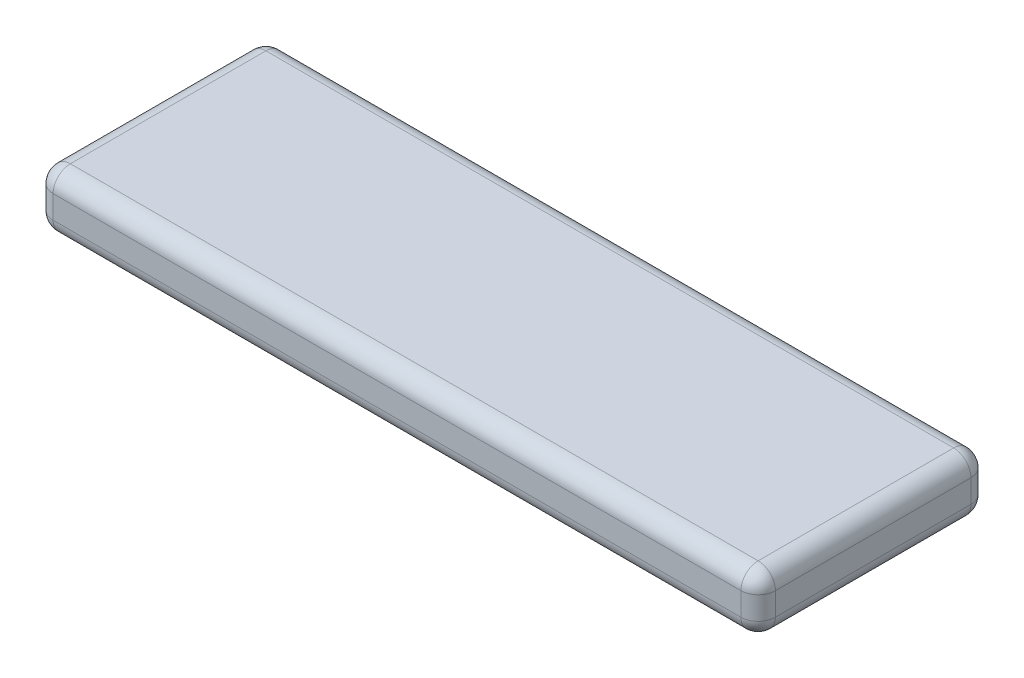
ISO-10303-21;
HEADER;
FILE_DESCRIPTION(('STEP AP214'),'2;1');
FILE_NAME('part.step','',(''),(''),'','','');
FILE_SCHEMA(('AUTOMOTIVE_DESIGN { 1 0 10303 214 1 1 1 1 }'));
ENDSEC;
DATA;
#1=APPLICATION_CONTEXT('core data for automotive mechanical design processes');
#2=APPLICATION_PROTOCOL_DEFINITION('international standard','automotive_design',2000,#1);
#3=PRODUCT_CONTEXT('',#1,'mechanical');
#4=PRODUCT('Part','Part','',(#3));
#5=PRODUCT_RELATED_PRODUCT_CATEGORY('part','',(#4));
#6=PRODUCT_DEFINITION_FORMATION('','',#4);
#7=PRODUCT_DEFINITION_CONTEXT('part definition',#1,'design');
#8=PRODUCT_DEFINITION('design','',#6,#7);
#9=PRODUCT_DEFINITION_SHAPE('','',#8);
#10=(LENGTH_UNIT() NAMED_UNIT(*) SI_UNIT(.MILLI.,.METRE.));
#11=(NAMED_UNIT(*) PLANE_ANGLE_UNIT() SI_UNIT($,.RADIAN.));
#12=(NAMED_UNIT(*) SI_UNIT($,.STERADIAN.) SOLID_ANGLE_UNIT());
#13=UNCERTAINTY_MEASURE_WITH_UNIT(LENGTH_MEASURE(1.E-05),#10,'distance_accuracy_value','');
#14=(GEOMETRIC_REPRESENTATION_CONTEXT(3) GLOBAL_UNCERTAINTY_ASSIGNED_CONTEXT((#13)) GLOBAL_UNIT_ASSIGNED_CONTEXT((#10,
#11,#12)) REPRESENTATION_CONTEXT('',''));
#15=CARTESIAN_POINT('',(0.,0.,0.));
#16=DIRECTION('',(0.,0.,1.));
#17=DIRECTION('',(1.,0.,0.));
#18=AXIS2_PLACEMENT_3D('',#15,#16,#17);
#19=CARTESIAN_POINT('',(0.,100.,0.));
#20=DIRECTION('',(1.,0.,0.));
#21=DIRECTION('',(0.,0.,-1.));
#22=AXIS2_PLACEMENT_3D('',#19,#20,#21);
#23=PLANE('',#22);
#24=DIRECTION('',(0.,-1.,0.));
#25=VECTOR('',#24,1.);
#26=CARTESIAN_POINT('',(0.,100.,-370.));
#27=LINE('',#26,#25);
#28=CARTESIAN_POINT('',(0.,70.,-370.));
#29=VERTEX_POINT('',#28);
#30=CARTESIAN_POINT('',(0.,30.,-370.));
#31=VERTEX_POINT('',#30);
#32=EDGE_CURVE('E130',#29,#31,#27,.T.);
#33=ORIENTED_EDGE('',*,*,#32,.T.);
#34=DIRECTION('',(0.,0.,1.));
#35=VECTOR('',#34,1.);
#36=CARTESIAN_POINT('',(0.,30.,0.));
#37=LINE('',#36,#35);
#38=CARTESIAN_POINT('',(0.,30.,-30.));
#39=VERTEX_POINT('',#38);
#40=EDGE_CURVE('E126',#31,#39,#37,.T.);
#41=ORIENTED_EDGE('',*,*,#40,.T.);
#42=DIRECTION('',(0.,-1.,0.));
#43=VECTOR('',#42,1.);
#44=CARTESIAN_POINT('',(0.,100.,-30.));
#45=LINE('',#44,#43);
#46=CARTESIAN_POINT('',(0.,70.,-30.));
#47=VERTEX_POINT('',#46);
#48=EDGE_CURVE('E121',#39,#47,#45,.F.);
#49=ORIENTED_EDGE('',*,*,#48,.T.);
#50=DIRECTION('',(0.,0.,1.));
#51=VECTOR('',#50,1.);
#52=CARTESIAN_POINT('',(0.,70.,0.));
#53=LINE('',#52,#51);
#54=EDGE_CURVE('E123',#47,#29,#53,.F.);
#55=ORIENTED_EDGE('',*,*,#54,.T.);
#56=EDGE_LOOP('',(#33,#41,#49,#55));
#57=FACE_BOUND('',#56,.T.);
#58=ADVANCED_FACE('F33',(#57),#23,.F.);
#59=CARTESIAN_POINT('',(0.,100.,0.));
#60=DIRECTION('',(0.,0.,-1.));
#61=DIRECTION('',(-1.,0.,0.));
#62=AXIS2_PLACEMENT_3D('',#59,#60,#61);
#63=PLANE('',#62);
#64=DIRECTION('',(0.,-1.,0.));
#65=VECTOR('',#64,1.);
#66=CARTESIAN_POINT('',(1226.,100.,0.));
#67=LINE('',#66,#65);
#68=CARTESIAN_POINT('',(1226.,30.,0.));
#69=VERTEX_POINT('',#68);
#70=CARTESIAN_POINT('',(1226.,70.,0.));
#71=VERTEX_POINT('',#70);
#72=EDGE_CURVE('E229',#69,#71,#67,.F.);
#73=ORIENTED_EDGE('',*,*,#72,.T.);
#74=DIRECTION('',(1.,0.,0.));
#75=VECTOR('',#74,1.);
#76=CARTESIAN_POINT('',(0.,70.,0.));
#77=LINE('',#76,#75);
#78=CARTESIAN_POINT('',(30.,70.,0.));
#79=VERTEX_POINT('',#78);
#80=EDGE_CURVE('E232',#71,#79,#77,.F.);
#81=ORIENTED_EDGE('',*,*,#80,.T.);
#82=DIRECTION('',(0.,-1.,0.));
#83=VECTOR('',#82,1.);
#84=CARTESIAN_POINT('',(30.,100.,0.));
#85=LINE('',#84,#83);
#86=CARTESIAN_POINT('',(30.,30.,0.));
#87=VERTEX_POINT('',#86);
#88=EDGE_CURVE('E152',#79,#87,#85,.T.);
#89=ORIENTED_EDGE('',*,*,#88,.T.);
#90=DIRECTION('',(1.,0.,0.));
#91=VECTOR('',#90,1.);
#92=CARTESIAN_POINT('',(1256.,30.,0.));
#93=LINE('',#92,#91);
#94=EDGE_CURVE('E227',#87,#69,#93,.T.);
#95=ORIENTED_EDGE('',*,*,#94,.T.);
#96=EDGE_LOOP('',(#73,#81,#89,#95));
#97=FACE_BOUND('',#96,.T.);
#98=ADVANCED_FACE('F313',(#97),#63,.F.);
#99=CARTESIAN_POINT('',(1256.,100.,0.));
#100=DIRECTION('',(-1.,0.,0.));
#101=DIRECTION('',(0.,0.,1.));
#102=AXIS2_PLACEMENT_3D('',#99,#100,#101);
#103=PLANE('',#102);
#104=DIRECTION('',(0.,-1.,0.));
#105=VECTOR('',#104,1.);
#106=CARTESIAN_POINT('',(1256.,100.,-370.));
#107=LINE('',#106,#105);
#108=CARTESIAN_POINT('',(1256.,30.,-370.));
#109=VERTEX_POINT('',#108);
#110=CARTESIAN_POINT('',(1256.,70.,-370.));
#111=VERTEX_POINT('',#110);
#112=EDGE_CURVE('E211',#109,#111,#107,.F.);
#113=ORIENTED_EDGE('',*,*,#112,.T.);
#114=DIRECTION('',(0.,0.,-1.));
#115=VECTOR('',#114,1.);
#116=CARTESIAN_POINT('',(1256.,70.,0.));
#117=LINE('',#116,#115);
#118=CARTESIAN_POINT('',(1256.,70.,-30.));
#119=VERTEX_POINT('',#118);
#120=EDGE_CURVE('E240',#111,#119,#117,.F.);
#121=ORIENTED_EDGE('',*,*,#120,.T.);
#122=DIRECTION('',(0.,-1.,0.));
#123=VECTOR('',#122,1.);
#124=CARTESIAN_POINT('',(1256.,100.,-30.));
#125=LINE('',#124,#123);
#126=CARTESIAN_POINT('',(1256.,30.,-30.));
#127=VERTEX_POINT('',#126);
#128=EDGE_CURVE('E237',#119,#127,#125,.T.);
#129=ORIENTED_EDGE('',*,*,#128,.T.);
#130=DIRECTION('',(0.,0.,-1.));
#131=VECTOR('',#130,1.);
#132=CARTESIAN_POINT('',(1256.,30.,-400.));
#133=LINE('',#132,#131);
#134=EDGE_CURVE('E234',#127,#109,#133,.T.);
#135=ORIENTED_EDGE('',*,*,#134,.T.);
#136=EDGE_LOOP('',(#113,#121,#129,#135));
#137=FACE_BOUND('',#136,.T.);
#138=ADVANCED_FACE('F305',(#137),#103,.F.);
#139=CARTESIAN_POINT('',(0.,100.,-400.));
#140=DIRECTION('',(0.,0.,1.));
#141=DIRECTION('',(1.,0.,0.));
#142=AXIS2_PLACEMENT_3D('',#139,#140,#141);
#143=PLANE('',#142);
#144=DIRECTION('',(-1.,0.,0.));
#145=VECTOR('',#144,1.);
#146=CARTESIAN_POINT('',(0.,30.,-400.));
#147=LINE('',#146,#145);
#148=CARTESIAN_POINT('',(1226.,30.,-400.));
#149=VERTEX_POINT('',#148);
#150=CARTESIAN_POINT('',(30.,30.,-400.));
#151=VERTEX_POINT('',#150);
#152=EDGE_CURVE('E216',#149,#151,#147,.T.);
#153=ORIENTED_EDGE('',*,*,#152,.T.);
#154=DIRECTION('',(0.,-1.,0.));
#155=VECTOR('',#154,1.);
#156=CARTESIAN_POINT('',(30.,100.,-400.));
#157=LINE('',#156,#155);
#158=CARTESIAN_POINT('',(30.,70.,-400.));
#159=VERTEX_POINT('',#158);
#160=EDGE_CURVE('E219',#151,#159,#157,.F.);
#161=ORIENTED_EDGE('',*,*,#160,.T.);
#162=DIRECTION('',(-1.,0.,0.));
#163=VECTOR('',#162,1.);
#164=CARTESIAN_POINT('',(0.,70.,-400.));
#165=LINE('',#164,#163);
#166=CARTESIAN_POINT('',(1226.,70.,-400.));
#167=VERTEX_POINT('',#166);
#168=EDGE_CURVE('E217',#159,#167,#165,.F.);
#169=ORIENTED_EDGE('',*,*,#168,.T.);
#170=DIRECTION('',(0.,-1.,0.));
#171=VECTOR('',#170,1.);
#172=CARTESIAN_POINT('',(1226.,100.,-400.));
#173=LINE('',#172,#171);
#174=EDGE_CURVE('E213',#167,#149,#173,.T.);
#175=ORIENTED_EDGE('',*,*,#174,.T.);
#176=EDGE_LOOP('',(#153,#161,#169,#175));
#177=FACE_BOUND('',#176,.T.);
#178=ADVANCED_FACE('F288',(#177),#143,.F.);
#179=CARTESIAN_POINT('',(0.,100.,0.));
#180=DIRECTION('',(0.,-1.,0.));
#181=DIRECTION('',(0.,0.,-1.));
#182=AXIS2_PLACEMENT_3D('',#179,#180,#181);
#183=PLANE('',#182);
#184=DIRECTION('',(0.,0.,-1.));
#185=VECTOR('',#184,1.);
#186=CARTESIAN_POINT('',(1226.,100.,0.));
#187=LINE('',#186,#185);
#188=CARTESIAN_POINT('',(1226.,100.,-30.));
#189=VERTEX_POINT('',#188);
#190=CARTESIAN_POINT('',(1226.,100.,-370.));
#191=VERTEX_POINT('',#190);
#192=EDGE_CURVE('E42',#189,#191,#187,.T.);
#193=ORIENTED_EDGE('',*,*,#192,.T.);
#194=DIRECTION('',(-1.,0.,0.));
#195=VECTOR('',#194,1.);
#196=CARTESIAN_POINT('',(0.,100.,-370.));
#197=LINE('',#196,#195);
#198=CARTESIAN_POINT('',(30.,100.,-370.));
#199=VERTEX_POINT('',#198);
#200=EDGE_CURVE('E11',#191,#199,#197,.T.);
#201=ORIENTED_EDGE('',*,*,#200,.T.);
#202=DIRECTION('',(0.,0.,1.));
#203=VECTOR('',#202,1.);
#204=CARTESIAN_POINT('',(30.,100.,0.));
#205=LINE('',#204,#203);
#206=CARTESIAN_POINT('',(30.,100.,-30.));
#207=VERTEX_POINT('',#206);
#208=EDGE_CURVE('E242',#199,#207,#205,.T.);
#209=ORIENTED_EDGE('',*,*,#208,.T.);
#210=DIRECTION('',(1.,0.,0.));
#211=VECTOR('',#210,1.);
#212=CARTESIAN_POINT('',(0.,100.,-30.));
#213=LINE('',#212,#211);
#214=EDGE_CURVE('E53',#207,#189,#213,.T.);
#215=ORIENTED_EDGE('',*,*,#214,.T.);
#216=EDGE_LOOP('',(#193,#201,#209,#215));
#217=FACE_BOUND('',#216,.T.);
#218=ADVANCED_FACE('F293',(#217),#183,.F.);
#219=CARTESIAN_POINT('',(0.,0.,0.));
#220=DIRECTION('',(0.,-1.,0.));
#221=DIRECTION('',(0.,0.,-1.));
#222=AXIS2_PLACEMENT_3D('',#219,#220,#221);
#223=PLANE('',#222);
#224=DIRECTION('',(1.,0.,0.));
#225=VECTOR('',#224,1.);
#226=CARTESIAN_POINT('',(0.,0.,-30.));
#227=LINE('',#226,#225);
#228=CARTESIAN_POINT('',(1226.,0.,-30.));
#229=VERTEX_POINT('',#228);
#230=CARTESIAN_POINT('',(30.,0.,-30.));
#231=VERTEX_POINT('',#230);
#232=EDGE_CURVE('E276',#229,#231,#227,.F.);
#233=ORIENTED_EDGE('',*,*,#232,.T.);
#234=DIRECTION('',(0.,0.,1.));
#235=VECTOR('',#234,1.);
#236=CARTESIAN_POINT('',(30.,0.,-400.));
#237=LINE('',#236,#235);
#238=CARTESIAN_POINT('',(30.,0.,-370.));
#239=VERTEX_POINT('',#238);
#240=EDGE_CURVE('E221',#231,#239,#237,.F.);
#241=ORIENTED_EDGE('',*,*,#240,.T.);
#242=DIRECTION('',(-1.,0.,0.));
#243=VECTOR('',#242,1.);
#244=CARTESIAN_POINT('',(1256.,0.,-370.));
#245=LINE('',#244,#243);
#246=CARTESIAN_POINT('',(1226.,0.,-370.));
#247=VERTEX_POINT('',#246);
#248=EDGE_CURVE('E266',#239,#247,#245,.F.);
#249=ORIENTED_EDGE('',*,*,#248,.T.);
#250=DIRECTION('',(0.,0.,-1.));
#251=VECTOR('',#250,1.);
#252=CARTESIAN_POINT('',(1226.,0.,0.));
#253=LINE('',#252,#251);
#254=EDGE_CURVE('E271',#247,#229,#253,.F.);
#255=ORIENTED_EDGE('',*,*,#254,.T.);
#256=EDGE_LOOP('',(#233,#241,#249,#255));
#257=FACE_BOUND('',#256,.T.);
#258=ADVANCED_FACE('F274',(#257),#223,.T.);
#259=CARTESIAN_POINT('',(1226.,70.,0.));
#260=DIRECTION('',(0.,0.,-1.));
#261=DIRECTION('',(-1.,0.,0.));
#262=AXIS2_PLACEMENT_3D('',#259,#260,#261);
#263=CYLINDRICAL_SURFACE('',#262,30.);
#264=CARTESIAN_POINT('',(1226.,70.,-370.));
#265=DIRECTION('',(0.,0.,-1.));
#266=DIRECTION('',(-1.,0.,0.));
#267=AXIS2_PLACEMENT_3D('',#264,#265,#266);
#268=CIRCLE('',#267,30.);
#269=EDGE_CURVE('E37',#191,#111,#268,.T.);
#270=ORIENTED_EDGE('',*,*,#269,.F.);
#271=ORIENTED_EDGE('',*,*,#192,.F.);
#272=CARTESIAN_POINT('',(1226.,70.,-30.));
#273=DIRECTION('',(0.,0.,1.));
#274=DIRECTION('',(1.,0.,0.));
#275=AXIS2_PLACEMENT_3D('',#272,#273,#274);
#276=CIRCLE('',#275,30.);
#277=EDGE_CURVE('E192',#119,#189,#276,.T.);
#278=ORIENTED_EDGE('',*,*,#277,.F.);
#279=ORIENTED_EDGE('',*,*,#120,.F.);
#280=EDGE_LOOP('',(#270,#271,#278,#279));
#281=FACE_BOUND('',#280,.T.);
#282=ADVANCED_FACE('F35',(#281),#263,.T.);
#283=CARTESIAN_POINT('',(1226.,70.,-370.));
#284=DIRECTION('',(0.,0.,1.));
#285=DIRECTION('',(1.,0.,0.));
#286=AXIS2_PLACEMENT_3D('',#283,#284,#285);
#287=SPHERICAL_SURFACE('',#286,30.);
#288=CARTESIAN_POINT('',(1226.,70.,-370.));
#289=DIRECTION('',(1.,0.,0.));
#290=DIRECTION('',(0.,0.,-1.));
#291=AXIS2_PLACEMENT_3D('',#288,#289,#290);
#292=CIRCLE('',#291,30.);
#293=EDGE_CURVE('E187',#191,#167,#292,.F.);
#294=ORIENTED_EDGE('',*,*,#293,.F.);
#295=ORIENTED_EDGE('',*,*,#269,.T.);
#296=CARTESIAN_POINT('',(1226.,70.,-370.));
#297=DIRECTION('',(0.,1.,0.));
#298=DIRECTION('',(0.,0.,1.));
#299=AXIS2_PLACEMENT_3D('',#296,#297,#298);
#300=CIRCLE('',#299,30.);
#301=EDGE_CURVE('E190',#167,#111,#300,.F.);
#302=ORIENTED_EDGE('',*,*,#301,.F.);
#303=EDGE_LOOP('',(#294,#295,#302));
#304=FACE_BOUND('',#303,.T.);
#305=ADVANCED_FACE('F202',(#304),#287,.T.);
#306=CARTESIAN_POINT('',(1226.,70.,-30.));
#307=DIRECTION('',(0.,0.,1.));
#308=DIRECTION('',(1.,0.,0.));
#309=AXIS2_PLACEMENT_3D('',#306,#307,#308);
#310=SPHERICAL_SURFACE('',#309,30.);
#311=CARTESIAN_POINT('',(1226.,70.,-30.));
#312=DIRECTION('',(0.,1.,0.));
#313=DIRECTION('',(0.,0.,1.));
#314=AXIS2_PLACEMENT_3D('',#311,#312,#313);
#315=CIRCLE('',#314,30.);
#316=EDGE_CURVE('E181',#119,#71,#315,.F.);
#317=ORIENTED_EDGE('',*,*,#316,.F.);
#318=ORIENTED_EDGE('',*,*,#277,.T.);
#319=CARTESIAN_POINT('',(1226.,70.,-30.));
#320=DIRECTION('',(1.,0.,0.));
#321=DIRECTION('',(0.,0.,-1.));
#322=AXIS2_PLACEMENT_3D('',#319,#320,#321);
#323=CIRCLE('',#322,30.);
#324=EDGE_CURVE('E184',#71,#189,#323,.F.);
#325=ORIENTED_EDGE('',*,*,#324,.F.);
#326=EDGE_LOOP('',(#317,#318,#325));
#327=FACE_BOUND('',#326,.T.);
#328=ADVANCED_FACE('F297',(#327),#310,.T.);
#329=CARTESIAN_POINT('',(1226.,100.,-370.));
#330=DIRECTION('',(0.,-1.,0.));
#331=DIRECTION('',(0.,0.,-1.));
#332=AXIS2_PLACEMENT_3D('',#329,#330,#331);
#333=CYLINDRICAL_SURFACE('',#332,30.);
#334=ORIENTED_EDGE('',*,*,#301,.T.);
#335=ORIENTED_EDGE('',*,*,#112,.F.);
#336=CARTESIAN_POINT('',(1226.,30.,-370.));
#337=DIRECTION('',(0.,-1.,0.));
#338=DIRECTION('',(0.,0.,-1.));
#339=AXIS2_PLACEMENT_3D('',#336,#337,#338);
#340=CIRCLE('',#339,30.);
#341=EDGE_CURVE('E175',#149,#109,#340,.T.);
#342=ORIENTED_EDGE('',*,*,#341,.F.);
#343=ORIENTED_EDGE('',*,*,#174,.F.);
#344=EDGE_LOOP('',(#334,#335,#342,#343));
#345=FACE_BOUND('',#344,.T.);
#346=ADVANCED_FACE('F209',(#345),#333,.T.);
#347=CARTESIAN_POINT('',(0.,70.,-370.));
#348=DIRECTION('',(-1.,0.,0.));
#349=DIRECTION('',(0.,0.,1.));
#350=AXIS2_PLACEMENT_3D('',#347,#348,#349);
#351=CYLINDRICAL_SURFACE('',#350,30.);
#352=ORIENTED_EDGE('',*,*,#293,.T.);
#353=ORIENTED_EDGE('',*,*,#168,.F.);
#354=CARTESIAN_POINT('',(30.,70.,-370.));
#355=DIRECTION('',(-1.,0.,0.));
#356=DIRECTION('',(0.,0.,1.));
#357=AXIS2_PLACEMENT_3D('',#354,#355,#356);
#358=CIRCLE('',#357,30.);
#359=EDGE_CURVE('E172',#199,#159,#358,.T.);
#360=ORIENTED_EDGE('',*,*,#359,.F.);
#361=ORIENTED_EDGE('',*,*,#200,.F.);
#362=EDGE_LOOP('',(#352,#353,#360,#361));
#363=FACE_BOUND('',#362,.T.);
#364=ADVANCED_FACE('F292',(#363),#351,.T.);
#365=CARTESIAN_POINT('',(30.,70.,0.));
#366=DIRECTION('',(0.,0.,1.));
#367=DIRECTION('',(1.,0.,0.));
#368=AXIS2_PLACEMENT_3D('',#365,#366,#367);
#369=CYLINDRICAL_SURFACE('',#368,30.);
#370=CARTESIAN_POINT('',(30.,70.,-30.));
#371=DIRECTION('',(0.,0.,1.));
#372=DIRECTION('',(1.,0.,0.));
#373=AXIS2_PLACEMENT_3D('',#370,#371,#372);
#374=CIRCLE('',#373,30.);
#375=EDGE_CURVE('E137',#207,#47,#374,.T.);
#376=ORIENTED_EDGE('',*,*,#375,.F.);
#377=ORIENTED_EDGE('',*,*,#208,.F.);
#378=CARTESIAN_POINT('',(30.,70.,-370.));
#379=DIRECTION('',(0.,0.,-1.));
#380=DIRECTION('',(-1.,0.,0.));
#381=AXIS2_PLACEMENT_3D('',#378,#379,#380);
#382=CIRCLE('',#381,30.);
#383=EDGE_CURVE('E139',#29,#199,#382,.T.);
#384=ORIENTED_EDGE('',*,*,#383,.F.);
#385=ORIENTED_EDGE('',*,*,#54,.F.);
#386=EDGE_LOOP('',(#376,#377,#384,#385));
#387=FACE_BOUND('',#386,.T.);
#388=ADVANCED_FACE('F135',(#387),#369,.T.);
#389=CARTESIAN_POINT('',(0.,70.,-30.));
#390=DIRECTION('',(1.,0.,0.));
#391=DIRECTION('',(0.,0.,-1.));
#392=AXIS2_PLACEMENT_3D('',#389,#390,#391);
#393=CYLINDRICAL_SURFACE('',#392,30.);
#394=ORIENTED_EDGE('',*,*,#324,.T.);
#395=ORIENTED_EDGE('',*,*,#214,.F.);
#396=CARTESIAN_POINT('',(30.,70.,-30.));
#397=DIRECTION('',(-1.,0.,0.));
#398=DIRECTION('',(0.,0.,1.));
#399=AXIS2_PLACEMENT_3D('',#396,#397,#398);
#400=CIRCLE('',#399,30.);
#401=EDGE_CURVE('E148',#79,#207,#400,.T.);
#402=ORIENTED_EDGE('',*,*,#401,.F.);
#403=ORIENTED_EDGE('',*,*,#80,.F.);
#404=EDGE_LOOP('',(#394,#395,#402,#403));
#405=FACE_BOUND('',#404,.T.);
#406=ADVANCED_FACE('F295',(#405),#393,.T.);
#407=CARTESIAN_POINT('',(1226.,100.,-30.));
#408=DIRECTION('',(0.,-1.,0.));
#409=DIRECTION('',(0.,0.,-1.));
#410=AXIS2_PLACEMENT_3D('',#407,#408,#409);
#411=CYLINDRICAL_SURFACE('',#410,30.);
#412=ORIENTED_EDGE('',*,*,#316,.T.);
#413=ORIENTED_EDGE('',*,*,#72,.F.);
#414=CARTESIAN_POINT('',(1226.,30.,-30.));
#415=DIRECTION('',(0.,-1.,0.));
#416=DIRECTION('',(0.,0.,-1.));
#417=AXIS2_PLACEMENT_3D('',#414,#415,#416);
#418=CIRCLE('',#417,30.);
#419=EDGE_CURVE('E167',#127,#69,#418,.T.);
#420=ORIENTED_EDGE('',*,*,#419,.F.);
#421=ORIENTED_EDGE('',*,*,#128,.F.);
#422=EDGE_LOOP('',(#412,#413,#420,#421));
#423=FACE_BOUND('',#422,.T.);
#424=ADVANCED_FACE('F302',(#423),#411,.T.);
#425=CARTESIAN_POINT('',(1226.,30.,0.));
#426=DIRECTION('',(0.,0.,1.));
#427=DIRECTION('',(1.,0.,0.));
#428=AXIS2_PLACEMENT_3D('',#425,#426,#427);
#429=CYLINDRICAL_SURFACE('',#428,30.);
#430=CARTESIAN_POINT('',(1226.,30.,-370.));
#431=DIRECTION('',(0.,0.,-1.));
#432=DIRECTION('',(-1.,0.,0.));
#433=AXIS2_PLACEMENT_3D('',#430,#431,#432);
#434=CIRCLE('',#433,30.);
#435=EDGE_CURVE('E178',#109,#247,#434,.T.);
#436=ORIENTED_EDGE('',*,*,#435,.F.);
#437=ORIENTED_EDGE('',*,*,#134,.F.);
#438=CARTESIAN_POINT('',(1226.,30.,-30.));
#439=DIRECTION('',(0.,0.,1.));
#440=DIRECTION('',(1.,0.,0.));
#441=AXIS2_PLACEMENT_3D('',#438,#439,#440);
#442=CIRCLE('',#441,30.);
#443=EDGE_CURVE('E165',#229,#127,#442,.T.);
#444=ORIENTED_EDGE('',*,*,#443,.F.);
#445=ORIENTED_EDGE('',*,*,#254,.F.);
#446=EDGE_LOOP('',(#436,#437,#444,#445));
#447=FACE_BOUND('',#446,.T.);
#448=ADVANCED_FACE('F354',(#447),#429,.T.);
#449=CARTESIAN_POINT('',(1226.,30.,-370.));
#450=DIRECTION('',(0.,0.,1.));
#451=DIRECTION('',(1.,0.,0.));
#452=AXIS2_PLACEMENT_3D('',#449,#450,#451);
#453=SPHERICAL_SURFACE('',#452,30.);
#454=ORIENTED_EDGE('',*,*,#341,.T.);
#455=ORIENTED_EDGE('',*,*,#435,.T.);
#456=CARTESIAN_POINT('',(1226.,30.,-370.));
#457=DIRECTION('',(1.,0.,0.));
#458=DIRECTION('',(0.,0.,-1.));
#459=AXIS2_PLACEMENT_3D('',#456,#457,#458);
#460=CIRCLE('',#459,30.);
#461=EDGE_CURVE('E156',#149,#247,#460,.F.);
#462=ORIENTED_EDGE('',*,*,#461,.F.);
#463=EDGE_LOOP('',(#454,#455,#462));
#464=FACE_BOUND('',#463,.T.);
#465=ADVANCED_FACE('F350',(#464),#453,.T.);
#466=CARTESIAN_POINT('',(30.,70.,-370.));
#467=DIRECTION('',(0.,0.,1.));
#468=DIRECTION('',(1.,0.,0.));
#469=AXIS2_PLACEMENT_3D('',#466,#467,#468);
#470=SPHERICAL_SURFACE('',#469,30.);
#471=ORIENTED_EDGE('',*,*,#383,.T.);
#472=ORIENTED_EDGE('',*,*,#359,.T.);
#473=CARTESIAN_POINT('',(30.,70.,-370.));
#474=DIRECTION('',(0.,1.,0.));
#475=DIRECTION('',(0.,0.,1.));
#476=AXIS2_PLACEMENT_3D('',#473,#474,#475);
#477=CIRCLE('',#476,30.);
#478=EDGE_CURVE('E153',#29,#159,#477,.F.);
#479=ORIENTED_EDGE('',*,*,#478,.F.);
#480=EDGE_LOOP('',(#471,#472,#479));
#481=FACE_BOUND('',#480,.T.);
#482=ADVANCED_FACE('F347',(#481),#470,.T.);
#483=CARTESIAN_POINT('',(30.,70.,-30.));
#484=DIRECTION('',(0.,0.,1.));
#485=DIRECTION('',(1.,0.,0.));
#486=AXIS2_PLACEMENT_3D('',#483,#484,#485);
#487=SPHERICAL_SURFACE('',#486,30.);
#488=ORIENTED_EDGE('',*,*,#401,.T.);
#489=ORIENTED_EDGE('',*,*,#375,.T.);
#490=CARTESIAN_POINT('',(30.,70.,-30.));
#491=DIRECTION('',(0.,1.,0.));
#492=DIRECTION('',(0.,0.,1.));
#493=AXIS2_PLACEMENT_3D('',#490,#491,#492);
#494=CIRCLE('',#493,30.);
#495=EDGE_CURVE('E145',#79,#47,#494,.F.);
#496=ORIENTED_EDGE('',*,*,#495,.F.);
#497=EDGE_LOOP('',(#488,#489,#496));
#498=FACE_BOUND('',#497,.T.);
#499=ADVANCED_FACE('F144',(#498),#487,.T.);
#500=CARTESIAN_POINT('',(1226.,30.,-30.));
#501=DIRECTION('',(0.,0.,1.));
#502=DIRECTION('',(1.,0.,0.));
#503=AXIS2_PLACEMENT_3D('',#500,#501,#502);
#504=SPHERICAL_SURFACE('',#503,30.);
#505=ORIENTED_EDGE('',*,*,#443,.T.);
#506=ORIENTED_EDGE('',*,*,#419,.T.);
#507=CARTESIAN_POINT('',(1226.,30.,-30.));
#508=DIRECTION('',(1.,0.,0.));
#509=DIRECTION('',(0.,0.,-1.));
#510=AXIS2_PLACEMENT_3D('',#507,#508,#509);
#511=CIRCLE('',#510,30.);
#512=EDGE_CURVE('E154',#229,#69,#511,.F.);
#513=ORIENTED_EDGE('',*,*,#512,.F.);
#514=EDGE_LOOP('',(#505,#506,#513));
#515=FACE_BOUND('',#514,.T.);
#516=ADVANCED_FACE('F341',(#515),#504,.T.);
#517=CARTESIAN_POINT('',(0.,30.,-370.));
#518=DIRECTION('',(1.,0.,0.));
#519=DIRECTION('',(0.,0.,-1.));
#520=AXIS2_PLACEMENT_3D('',#517,#518,#519);
#521=CYLINDRICAL_SURFACE('',#520,30.);
#522=ORIENTED_EDGE('',*,*,#461,.T.);
#523=ORIENTED_EDGE('',*,*,#248,.F.);
#524=CARTESIAN_POINT('',(30.,30.,-370.));
#525=DIRECTION('',(-1.,0.,0.));
#526=DIRECTION('',(0.,0.,1.));
#527=AXIS2_PLACEMENT_3D('',#524,#525,#526);
#528=CIRCLE('',#527,30.);
#529=EDGE_CURVE('E159',#151,#239,#528,.T.);
#530=ORIENTED_EDGE('',*,*,#529,.F.);
#531=ORIENTED_EDGE('',*,*,#152,.F.);
#532=EDGE_LOOP('',(#522,#523,#530,#531));
#533=FACE_BOUND('',#532,.T.);
#534=ADVANCED_FACE('F268',(#533),#521,.T.);
#535=CARTESIAN_POINT('',(30.,100.,-370.));
#536=DIRECTION('',(0.,-1.,0.));
#537=DIRECTION('',(0.,0.,-1.));
#538=AXIS2_PLACEMENT_3D('',#535,#536,#537);
#539=CYLINDRICAL_SURFACE('',#538,30.);
#540=ORIENTED_EDGE('',*,*,#478,.T.);
#541=ORIENTED_EDGE('',*,*,#160,.F.);
#542=CARTESIAN_POINT('',(30.,30.,-370.));
#543=DIRECTION('',(0.,-1.,0.));
#544=DIRECTION('',(0.,0.,-1.));
#545=AXIS2_PLACEMENT_3D('',#542,#543,#544);
#546=CIRCLE('',#545,30.);
#547=EDGE_CURVE('E255',#31,#151,#546,.T.);
#548=ORIENTED_EDGE('',*,*,#547,.F.);
#549=ORIENTED_EDGE('',*,*,#32,.F.);
#550=EDGE_LOOP('',(#540,#541,#548,#549));
#551=FACE_BOUND('',#550,.T.);
#552=ADVANCED_FACE('F287',(#551),#539,.T.);
#553=CARTESIAN_POINT('',(30.,100.,-30.));
#554=DIRECTION('',(0.,-1.,0.));
#555=DIRECTION('',(0.,0.,-1.));
#556=AXIS2_PLACEMENT_3D('',#553,#554,#555);
#557=CYLINDRICAL_SURFACE('',#556,30.);
#558=ORIENTED_EDGE('',*,*,#495,.T.);
#559=ORIENTED_EDGE('',*,*,#48,.F.);
#560=CARTESIAN_POINT('',(30.,30.,-30.));
#561=DIRECTION('',(0.,-1.,0.));
#562=DIRECTION('',(0.,0.,-1.));
#563=AXIS2_PLACEMENT_3D('',#560,#561,#562);
#564=CIRCLE('',#563,30.);
#565=EDGE_CURVE('E252',#87,#39,#564,.T.);
#566=ORIENTED_EDGE('',*,*,#565,.F.);
#567=ORIENTED_EDGE('',*,*,#88,.F.);
#568=EDGE_LOOP('',(#558,#559,#566,#567));
#569=FACE_BOUND('',#568,.T.);
#570=ADVANCED_FACE('F150',(#569),#557,.T.);
#571=CARTESIAN_POINT('',(0.,30.,-30.));
#572=DIRECTION('',(-1.,0.,0.));
#573=DIRECTION('',(0.,0.,1.));
#574=AXIS2_PLACEMENT_3D('',#571,#572,#573);
#575=CYLINDRICAL_SURFACE('',#574,30.);
#576=ORIENTED_EDGE('',*,*,#512,.T.);
#577=ORIENTED_EDGE('',*,*,#94,.F.);
#578=CARTESIAN_POINT('',(30.,30.,-30.));
#579=DIRECTION('',(-1.,0.,0.));
#580=DIRECTION('',(0.,0.,1.));
#581=AXIS2_PLACEMENT_3D('',#578,#579,#580);
#582=CIRCLE('',#581,30.);
#583=EDGE_CURVE('E250',#231,#87,#582,.T.);
#584=ORIENTED_EDGE('',*,*,#583,.F.);
#585=ORIENTED_EDGE('',*,*,#232,.F.);
#586=EDGE_LOOP('',(#576,#577,#584,#585));
#587=FACE_BOUND('',#586,.T.);
#588=ADVANCED_FACE('F331',(#587),#575,.T.);
#589=CARTESIAN_POINT('',(30.,30.,-370.));
#590=DIRECTION('',(0.,0.,1.));
#591=DIRECTION('',(1.,0.,0.));
#592=AXIS2_PLACEMENT_3D('',#589,#590,#591);
#593=SPHERICAL_SURFACE('',#592,30.);
#594=ORIENTED_EDGE('',*,*,#547,.T.);
#595=ORIENTED_EDGE('',*,*,#529,.T.);
#596=CARTESIAN_POINT('',(30.,30.,-370.));
#597=DIRECTION('',(0.,0.,-1.));
#598=DIRECTION('',(-1.,0.,0.));
#599=AXIS2_PLACEMENT_3D('',#596,#597,#598);
#600=CIRCLE('',#599,30.);
#601=EDGE_CURVE('E248',#31,#239,#600,.F.);
#602=ORIENTED_EDGE('',*,*,#601,.F.);
#603=EDGE_LOOP('',(#594,#595,#602));
#604=FACE_BOUND('',#603,.T.);
#605=ADVANCED_FACE('F262',(#604),#593,.T.);
#606=CARTESIAN_POINT('',(30.,30.,-30.));
#607=DIRECTION('',(0.,0.,1.));
#608=DIRECTION('',(1.,0.,0.));
#609=AXIS2_PLACEMENT_3D('',#606,#607,#608);
#610=SPHERICAL_SURFACE('',#609,30.);
#611=ORIENTED_EDGE('',*,*,#583,.T.);
#612=ORIENTED_EDGE('',*,*,#565,.T.);
#613=CARTESIAN_POINT('',(30.,30.,-30.));
#614=DIRECTION('',(0.,0.,1.));
#615=DIRECTION('',(1.,0.,0.));
#616=AXIS2_PLACEMENT_3D('',#613,#614,#615);
#617=CIRCLE('',#616,30.);
#618=EDGE_CURVE('E246',#231,#39,#617,.F.);
#619=ORIENTED_EDGE('',*,*,#618,.F.);
#620=EDGE_LOOP('',(#611,#612,#619));
#621=FACE_BOUND('',#620,.T.);
#622=ADVANCED_FACE('F325',(#621),#610,.T.);
#623=CARTESIAN_POINT('',(30.,30.,0.));
#624=DIRECTION('',(0.,0.,-1.));
#625=DIRECTION('',(-1.,0.,0.));
#626=AXIS2_PLACEMENT_3D('',#623,#624,#625);
#627=CYLINDRICAL_SURFACE('',#626,30.);
#628=ORIENTED_EDGE('',*,*,#601,.T.);
#629=ORIENTED_EDGE('',*,*,#240,.F.);
#630=ORIENTED_EDGE('',*,*,#618,.T.);
#631=ORIENTED_EDGE('',*,*,#40,.F.);
#632=EDGE_LOOP('',(#628,#629,#630,#631));
#633=FACE_BOUND('',#632,.T.);
#634=ADVANCED_FACE('F322',(#633),#627,.T.);
#635=CLOSED_SHELL('',(#58,#98,#138,#178,#218,#258,#282,#305,#328,#346,#364,#388,#406,#424,#448,
#465,#482,#499,#516,#534,#552,#570,#588,#605,#622,#634));
#636=MANIFOLD_SOLID_BREP('B2',#635);
#637=ADVANCED_BREP_SHAPE_REPRESENTATION('',(#18,#636),#14);
#638=SHAPE_DEFINITION_REPRESENTATION(#9,#637);
ENDSEC;
END-ISO-10303-21;
